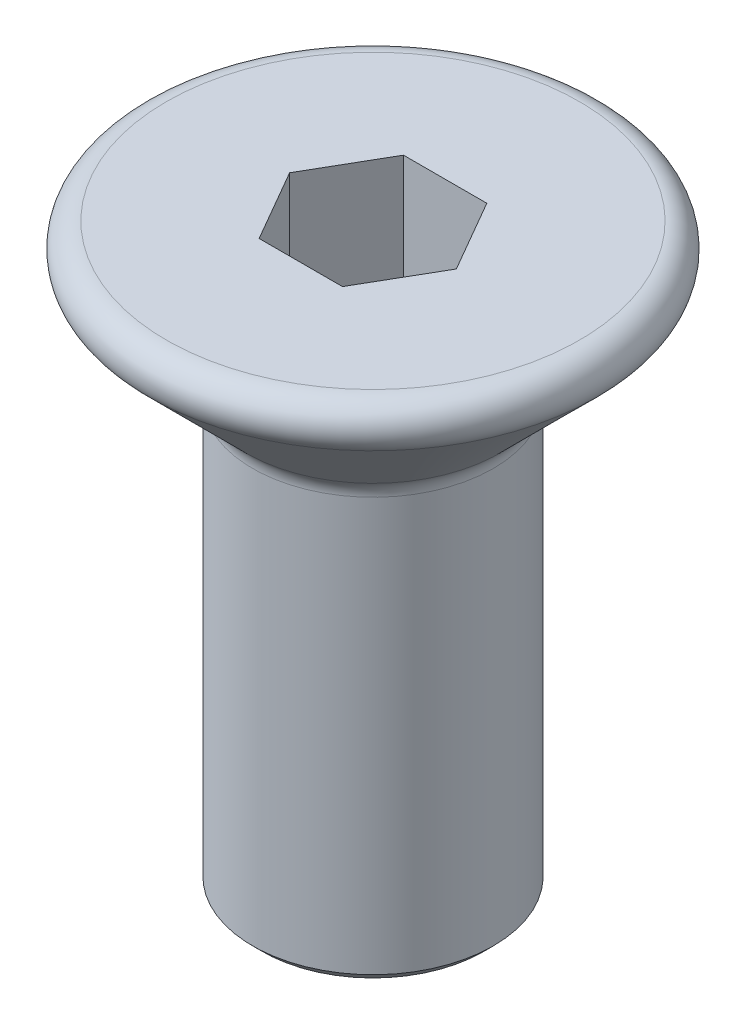
ISO-10303-21;
HEADER;
FILE_DESCRIPTION(('STEP AP214'),'2;1');
FILE_NAME('part.step','',(''),(''),'','','');
FILE_SCHEMA(('AUTOMOTIVE_DESIGN { 1 0 10303 214 1 1 1 1 }'));
ENDSEC;
DATA;
#1=APPLICATION_CONTEXT('core data for automotive mechanical design processes');
#2=APPLICATION_PROTOCOL_DEFINITION('international standard','automotive_design',2000,#1);
#3=PRODUCT_CONTEXT('',#1,'mechanical');
#4=PRODUCT('Part','Part','',(#3));
#5=PRODUCT_RELATED_PRODUCT_CATEGORY('part','',(#4));
#6=PRODUCT_DEFINITION_FORMATION('','',#4);
#7=PRODUCT_DEFINITION_CONTEXT('part definition',#1,'design');
#8=PRODUCT_DEFINITION('design','',#6,#7);
#9=PRODUCT_DEFINITION_SHAPE('','',#8);
#10=(LENGTH_UNIT() NAMED_UNIT(*) SI_UNIT(.MILLI.,.METRE.));
#11=(NAMED_UNIT(*) PLANE_ANGLE_UNIT() SI_UNIT($,.RADIAN.));
#12=(NAMED_UNIT(*) SI_UNIT($,.STERADIAN.) SOLID_ANGLE_UNIT());
#13=UNCERTAINTY_MEASURE_WITH_UNIT(LENGTH_MEASURE(1.E-05),#10,'distance_accuracy_value','');
#14=(GEOMETRIC_REPRESENTATION_CONTEXT(3) GLOBAL_UNCERTAINTY_ASSIGNED_CONTEXT((#13)) GLOBAL_UNIT_ASSIGNED_CONTEXT((#10,
#11,#12)) REPRESENTATION_CONTEXT('',''));
#15=CARTESIAN_POINT('',(0.,0.,0.));
#16=DIRECTION('',(0.,0.,1.));
#17=DIRECTION('',(1.,0.,0.));
#18=AXIS2_PLACEMENT_3D('',#15,#16,#17);
#19=CARTESIAN_POINT('',(0.,0.,0.));
#20=DIRECTION('',(0.,1.,0.));
#21=DIRECTION('',(-1.,0.,0.));
#22=AXIS2_PLACEMENT_3D('',#19,#20,#21);
#23=PLANE('',#22);
#24=DIRECTION('',(0.5,0.,-0.866025403784439));
#25=VECTOR('',#24,1.);
#26=CARTESIAN_POINT('',(0.866025403784439,0.,1.5));
#27=LINE('',#26,#25);
#28=CARTESIAN_POINT('',(0.866025403784439,0.,1.5));
#29=VERTEX_POINT('',#28);
#30=CARTESIAN_POINT('',(1.73205080756887,0.,0.));
#31=VERTEX_POINT('',#30);
#32=EDGE_CURVE('E32',#29,#31,#27,.T.);
#33=ORIENTED_EDGE('',*,*,#32,.F.);
#34=DIRECTION('',(1.,0.,0.));
#35=VECTOR('',#34,1.);
#36=CARTESIAN_POINT('',(-0.866025403784438,0.,1.5));
#37=LINE('',#36,#35);
#38=CARTESIAN_POINT('',(-0.866025403784438,0.,1.5));
#39=VERTEX_POINT('',#38);
#40=EDGE_CURVE('E115',#39,#29,#37,.T.);
#41=ORIENTED_EDGE('',*,*,#40,.F.);
#42=DIRECTION('',(0.5,0.,0.866025403784439));
#43=VECTOR('',#42,1.);
#44=CARTESIAN_POINT('',(-1.73205080756887,0.,0.));
#45=LINE('',#44,#43);
#46=CARTESIAN_POINT('',(-1.73205080756887,0.,0.));
#47=VERTEX_POINT('',#46);
#48=EDGE_CURVE('E113',#47,#39,#45,.T.);
#49=ORIENTED_EDGE('',*,*,#48,.F.);
#50=DIRECTION('',(-0.5,0.,0.866025403784439));
#51=VECTOR('',#50,1.);
#52=CARTESIAN_POINT('',(-0.86602540378444,0.,-1.5));
#53=LINE('',#52,#51);
#54=CARTESIAN_POINT('',(-0.86602540378444,0.,-1.5));
#55=VERTEX_POINT('',#54);
#56=EDGE_CURVE('E80',#55,#47,#53,.T.);
#57=ORIENTED_EDGE('',*,*,#56,.F.);
#58=DIRECTION('',(-1.,0.,0.));
#59=VECTOR('',#58,1.);
#60=CARTESIAN_POINT('',(0.866025403784439,0.,-1.5));
#61=LINE('',#60,#59);
#62=CARTESIAN_POINT('',(0.866025403784439,0.,-1.5));
#63=VERTEX_POINT('',#62);
#64=EDGE_CURVE('E109',#63,#55,#61,.T.);
#65=ORIENTED_EDGE('',*,*,#64,.F.);
#66=DIRECTION('',(-0.5,0.,-0.866025403784439));
#67=VECTOR('',#66,1.);
#68=CARTESIAN_POINT('',(1.73205080756887,0.,0.));
#69=LINE('',#68,#67);
#70=EDGE_CURVE('E106',#31,#63,#69,.T.);
#71=ORIENTED_EDGE('',*,*,#70,.F.);
#72=EDGE_LOOP('',(#33,#41,#49,#57,#65,#71));
#73=FACE_BOUND('',#72,.T.);
#74=CARTESIAN_POINT('',(0.,0.,0.));
#75=DIRECTION('',(0.,1.,0.));
#76=DIRECTION('',(-1.,0.,0.));
#77=AXIS2_PLACEMENT_3D('',#74,#75,#76);
#78=CIRCLE('',#77,4.29289321881348);
#79=CARTESIAN_POINT('',(-4.29289321881348,0.,0.));
#80=VERTEX_POINT('',#79);
#81=EDGE_CURVE('E119',#80,#80,#78,.T.);
#82=ORIENTED_EDGE('',*,*,#81,.T.);
#83=EDGE_LOOP('',(#82));
#84=FACE_BOUND('',#83,.T.);
#85=ADVANCED_FACE('F17',(#73,#84),#23,.T.);
#86=CARTESIAN_POINT('',(0.,0.,0.));
#87=DIRECTION('',(0.,1.,0.));
#88=DIRECTION('',(-1.,0.,0.));
#89=AXIS2_PLACEMENT_3D('',#86,#87,#88);
#90=CONICAL_SURFACE('',#89,5.5,0.785398163397453);
#91=CARTESIAN_POINT('',(0.,-2.85355339059328,0.));
#92=DIRECTION('',(0.,1.,0.));
#93=DIRECTION('',(-1.,0.,0.));
#94=AXIS2_PLACEMENT_3D('',#91,#92,#93);
#95=CIRCLE('',#94,2.64644660940673);
#96=CARTESIAN_POINT('',(-2.64644660940673,-2.85355339059328,0.));
#97=VERTEX_POINT('',#96);
#98=EDGE_CURVE('E130',#97,#97,#95,.T.);
#99=ORIENTED_EDGE('',*,*,#98,.T.);
#100=EDGE_LOOP('',(#99));
#101=FACE_BOUND('',#100,.T.);
#102=CARTESIAN_POINT('',(0.,-0.853553390593276,0.));
#103=DIRECTION('',(0.,-1.,0.));
#104=DIRECTION('',(1.,0.,0.));
#105=AXIS2_PLACEMENT_3D('',#102,#103,#104);
#106=CIRCLE('',#105,4.64644660940675);
#107=CARTESIAN_POINT('',(4.64644660940675,-0.853553390593275,0.));
#108=VERTEX_POINT('',#107);
#109=EDGE_CURVE('E127',#108,#108,#106,.T.);
#110=ORIENTED_EDGE('',*,*,#109,.T.);
#111=EDGE_LOOP('',(#110));
#112=FACE_BOUND('',#111,.T.);
#113=ADVANCED_FACE('F152',(#101,#112),#90,.T.);
#114=CARTESIAN_POINT('',(0.,0.,0.));
#115=DIRECTION('',(0.,1.,0.));
#116=DIRECTION('',(-1.,0.,0.));
#117=AXIS2_PLACEMENT_3D('',#114,#115,#116);
#118=CYLINDRICAL_SURFACE('',#117,2.5);
#119=CARTESIAN_POINT('',(0.,-11.8,0.));
#120=DIRECTION('',(0.,-1.,0.));
#121=DIRECTION('',(1.,0.,0.));
#122=AXIS2_PLACEMENT_3D('',#119,#120,#121);
#123=CIRCLE('',#122,2.5);
#124=CARTESIAN_POINT('',(2.5,-11.8,0.));
#125=VERTEX_POINT('',#124);
#126=EDGE_CURVE('E25',#125,#125,#123,.F.);
#127=ORIENTED_EDGE('',*,*,#126,.T.);
#128=EDGE_LOOP('',(#127));
#129=FACE_BOUND('',#128,.T.);
#130=CARTESIAN_POINT('',(0.,-3.20710678118655,0.));
#131=DIRECTION('',(0.,1.,0.));
#132=DIRECTION('',(-1.,0.,0.));
#133=AXIS2_PLACEMENT_3D('',#130,#131,#132);
#134=CIRCLE('',#133,2.5);
#135=CARTESIAN_POINT('',(-2.5,-3.20710678118655,0.));
#136=VERTEX_POINT('',#135);
#137=EDGE_CURVE('E133',#136,#136,#134,.F.);
#138=ORIENTED_EDGE('',*,*,#137,.T.);
#139=EDGE_LOOP('',(#138));
#140=FACE_BOUND('',#139,.T.);
#141=ADVANCED_FACE('F138',(#129,#140),#118,.T.);
#142=CARTESIAN_POINT('',(-2.5,-12.,0.));
#143=DIRECTION('',(0.,-1.,0.));
#144=DIRECTION('',(1.,0.,0.));
#145=AXIS2_PLACEMENT_3D('',#142,#143,#144);
#146=PLANE('',#145);
#147=CARTESIAN_POINT('',(0.,-12.,0.));
#148=DIRECTION('',(0.,-1.,0.));
#149=DIRECTION('',(1.,0.,0.));
#150=AXIS2_PLACEMENT_3D('',#147,#148,#149);
#151=CIRCLE('',#150,2.3);
#152=CARTESIAN_POINT('',(2.3,-12.,0.));
#153=VERTEX_POINT('',#152);
#154=EDGE_CURVE('E11',#153,#153,#151,.T.);
#155=ORIENTED_EDGE('',*,*,#154,.T.);
#156=EDGE_LOOP('',(#155));
#157=FACE_BOUND('',#156,.T.);
#158=ADVANCED_FACE('F167',(#157),#146,.T.);
#159=CARTESIAN_POINT('',(0.,-0.5,0.));
#160=DIRECTION('',(0.,1.,0.));
#161=DIRECTION('',(-1.,0.,0.));
#162=AXIS2_PLACEMENT_3D('',#159,#160,#161);
#163=TOROIDAL_SURFACE('',#162,4.29289321881348,0.5);
#164=ORIENTED_EDGE('',*,*,#109,.F.);
#165=EDGE_LOOP('',(#164));
#166=FACE_BOUND('',#165,.T.);
#167=ORIENTED_EDGE('',*,*,#81,.F.);
#168=EDGE_LOOP('',(#167));
#169=FACE_BOUND('',#168,.T.);
#170=ADVANCED_FACE('F164',(#166,#169),#163,.T.);
#171=CARTESIAN_POINT('',(0.866025403784471,-3.,1.5));
#172=DIRECTION('',(0.866025403784439,0.,0.5));
#173=DIRECTION('',(0.5,0.,-0.866025403784439));
#174=AXIS2_PLACEMENT_3D('',#171,#172,#173);
#175=PLANE('',#174);
#176=ORIENTED_EDGE('',*,*,#32,.T.);
#177=DIRECTION('',(0.,1.,0.));
#178=VECTOR('',#177,1.);
#179=CARTESIAN_POINT('',(1.73205080756891,-3.,0.));
#180=LINE('',#179,#178);
#181=CARTESIAN_POINT('',(1.73205080756891,-3.,0.));
#182=VERTEX_POINT('',#181);
#183=EDGE_CURVE('E62',#182,#31,#180,.T.);
#184=ORIENTED_EDGE('',*,*,#183,.F.);
#185=DIRECTION('',(0.5,0.,-0.866025403784439));
#186=VECTOR('',#185,1.);
#187=CARTESIAN_POINT('',(0.866025403784471,-3.,1.5));
#188=LINE('',#187,#186);
#189=CARTESIAN_POINT('',(0.866025403784471,-3.,1.5));
#190=VERTEX_POINT('',#189);
#191=EDGE_CURVE('E117',#190,#182,#188,.T.);
#192=ORIENTED_EDGE('',*,*,#191,.F.);
#193=DIRECTION('',(0.,1.,0.));
#194=VECTOR('',#193,1.);
#195=CARTESIAN_POINT('',(0.866025403784471,-3.,1.5));
#196=LINE('',#195,#194);
#197=EDGE_CURVE('E40',#190,#29,#196,.T.);
#198=ORIENTED_EDGE('',*,*,#197,.T.);
#199=EDGE_LOOP('',(#176,#184,#192,#198));
#200=FACE_BOUND('',#199,.T.);
#201=ADVANCED_FACE('F166',(#200),#175,.F.);
#202=CARTESIAN_POINT('',(-0.866025403784406,-3.,1.5));
#203=DIRECTION('',(0.,0.,1.));
#204=DIRECTION('',(1.,0.,0.));
#205=AXIS2_PLACEMENT_3D('',#202,#203,#204);
#206=PLANE('',#205);
#207=ORIENTED_EDGE('',*,*,#40,.T.);
#208=ORIENTED_EDGE('',*,*,#197,.F.);
#209=DIRECTION('',(1.,0.,0.));
#210=VECTOR('',#209,1.);
#211=CARTESIAN_POINT('',(-0.866025403784406,-3.,1.5));
#212=LINE('',#211,#210);
#213=CARTESIAN_POINT('',(-0.866025403784406,-3.,1.5));
#214=VERTEX_POINT('',#213);
#215=EDGE_CURVE('E92',#214,#190,#212,.T.);
#216=ORIENTED_EDGE('',*,*,#215,.F.);
#217=DIRECTION('',(0.,1.,0.));
#218=VECTOR('',#217,1.);
#219=CARTESIAN_POINT('',(-0.866025403784406,-3.,1.5));
#220=LINE('',#219,#218);
#221=EDGE_CURVE('E84',#214,#39,#220,.T.);
#222=ORIENTED_EDGE('',*,*,#221,.T.);
#223=EDGE_LOOP('',(#207,#208,#216,#222));
#224=FACE_BOUND('',#223,.T.);
#225=ADVANCED_FACE('F174',(#224),#206,.F.);
#226=CARTESIAN_POINT('',(-1.73205080756884,-3.,0.));
#227=DIRECTION('',(-0.866025403784439,0.,0.5));
#228=DIRECTION('',(0.5,0.,0.866025403784439));
#229=AXIS2_PLACEMENT_3D('',#226,#227,#228);
#230=PLANE('',#229);
#231=ORIENTED_EDGE('',*,*,#48,.T.);
#232=ORIENTED_EDGE('',*,*,#221,.F.);
#233=DIRECTION('',(0.5,0.,0.866025403784439));
#234=VECTOR('',#233,1.);
#235=CARTESIAN_POINT('',(-1.73205080756884,-3.,0.));
#236=LINE('',#235,#234);
#237=CARTESIAN_POINT('',(-1.73205080756884,-3.,0.));
#238=VERTEX_POINT('',#237);
#239=EDGE_CURVE('E88',#238,#214,#236,.T.);
#240=ORIENTED_EDGE('',*,*,#239,.F.);
#241=DIRECTION('',(0.,1.,0.));
#242=VECTOR('',#241,1.);
#243=CARTESIAN_POINT('',(-1.73205080756884,-3.,0.));
#244=LINE('',#243,#242);
#245=EDGE_CURVE('E73',#238,#47,#244,.T.);
#246=ORIENTED_EDGE('',*,*,#245,.T.);
#247=EDGE_LOOP('',(#231,#232,#240,#246));
#248=FACE_BOUND('',#247,.T.);
#249=ADVANCED_FACE('F89',(#248),#230,.F.);
#250=CARTESIAN_POINT('',(-0.866025403784408,-3.,-1.5));
#251=DIRECTION('',(-0.866025403784439,0.,-0.5));
#252=DIRECTION('',(-0.5,0.,0.866025403784439));
#253=AXIS2_PLACEMENT_3D('',#250,#251,#252);
#254=PLANE('',#253);
#255=ORIENTED_EDGE('',*,*,#56,.T.);
#256=ORIENTED_EDGE('',*,*,#245,.F.);
#257=DIRECTION('',(-0.5,0.,0.866025403784439));
#258=VECTOR('',#257,1.);
#259=CARTESIAN_POINT('',(-0.866025403784408,-3.,-1.5));
#260=LINE('',#259,#258);
#261=CARTESIAN_POINT('',(-0.866025403784408,-3.,-1.5));
#262=VERTEX_POINT('',#261);
#263=EDGE_CURVE('E77',#262,#238,#260,.T.);
#264=ORIENTED_EDGE('',*,*,#263,.F.);
#265=DIRECTION('',(0.,1.,0.));
#266=VECTOR('',#265,1.);
#267=CARTESIAN_POINT('',(-0.866025403784408,-3.,-1.5));
#268=LINE('',#267,#266);
#269=EDGE_CURVE('E85',#262,#55,#268,.T.);
#270=ORIENTED_EDGE('',*,*,#269,.T.);
#271=EDGE_LOOP('',(#255,#256,#264,#270));
#272=FACE_BOUND('',#271,.T.);
#273=ADVANCED_FACE('F75',(#272),#254,.F.);
#274=CARTESIAN_POINT('',(0.86602540378447,-3.,-1.5));
#275=DIRECTION('',(0.,0.,-1.));
#276=DIRECTION('',(-1.,0.,0.));
#277=AXIS2_PLACEMENT_3D('',#274,#275,#276);
#278=PLANE('',#277);
#279=ORIENTED_EDGE('',*,*,#64,.T.);
#280=ORIENTED_EDGE('',*,*,#269,.F.);
#281=DIRECTION('',(-1.,0.,0.));
#282=VECTOR('',#281,1.);
#283=CARTESIAN_POINT('',(0.86602540378447,-3.,-1.5));
#284=LINE('',#283,#282);
#285=CARTESIAN_POINT('',(0.86602540378447,-3.,-1.5));
#286=VERTEX_POINT('',#285);
#287=EDGE_CURVE('E98',#286,#262,#284,.T.);
#288=ORIENTED_EDGE('',*,*,#287,.F.);
#289=DIRECTION('',(0.,1.,0.));
#290=VECTOR('',#289,1.);
#291=CARTESIAN_POINT('',(0.86602540378447,-3.,-1.5));
#292=LINE('',#291,#290);
#293=EDGE_CURVE('E122',#286,#63,#292,.T.);
#294=ORIENTED_EDGE('',*,*,#293,.T.);
#295=EDGE_LOOP('',(#279,#280,#288,#294));
#296=FACE_BOUND('',#295,.T.);
#297=ADVANCED_FACE('F190',(#296),#278,.F.);
#298=CARTESIAN_POINT('',(1.73205080756891,-3.,0.));
#299=DIRECTION('',(0.866025403784438,0.,-0.5));
#300=DIRECTION('',(-0.5,0.,-0.866025403784439));
#301=AXIS2_PLACEMENT_3D('',#298,#299,#300);
#302=PLANE('',#301);
#303=ORIENTED_EDGE('',*,*,#70,.T.);
#304=ORIENTED_EDGE('',*,*,#293,.F.);
#305=DIRECTION('',(-0.5,0.,-0.866025403784439));
#306=VECTOR('',#305,1.);
#307=CARTESIAN_POINT('',(1.73205080756891,-3.,0.));
#308=LINE('',#307,#306);
#309=EDGE_CURVE('E100',#182,#286,#308,.T.);
#310=ORIENTED_EDGE('',*,*,#309,.F.);
#311=ORIENTED_EDGE('',*,*,#183,.T.);
#312=EDGE_LOOP('',(#303,#304,#310,#311));
#313=FACE_BOUND('',#312,.T.);
#314=ADVANCED_FACE('F187',(#313),#302,.F.);
#315=CARTESIAN_POINT('',(0.,-3.,0.));
#316=DIRECTION('',(0.,1.,0.));
#317=DIRECTION('',(-1.,0.,0.));
#318=AXIS2_PLACEMENT_3D('',#315,#316,#317);
#319=PLANE('',#318);
#320=ORIENTED_EDGE('',*,*,#191,.T.);
#321=ORIENTED_EDGE('',*,*,#309,.T.);
#322=ORIENTED_EDGE('',*,*,#287,.T.);
#323=ORIENTED_EDGE('',*,*,#263,.T.);
#324=ORIENTED_EDGE('',*,*,#239,.T.);
#325=ORIENTED_EDGE('',*,*,#215,.T.);
#326=EDGE_LOOP('',(#320,#321,#322,#323,#324,#325));
#327=FACE_BOUND('',#326,.T.);
#328=ADVANCED_FACE('F95',(#327),#319,.T.);
#329=CARTESIAN_POINT('',(0.,-3.20710678118655,0.));
#330=DIRECTION('',(0.,1.,0.));
#331=DIRECTION('',(-1.,0.,0.));
#332=AXIS2_PLACEMENT_3D('',#329,#330,#331);
#333=TOROIDAL_SURFACE('',#332,3.,0.5);
#334=ORIENTED_EDGE('',*,*,#137,.F.);
#335=EDGE_LOOP('',(#334));
#336=FACE_BOUND('',#335,.T.);
#337=ORIENTED_EDGE('',*,*,#98,.F.);
#338=EDGE_LOOP('',(#337));
#339=FACE_BOUND('',#338,.T.);
#340=ADVANCED_FACE('F142',(#336,#339),#333,.F.);
#341=CARTESIAN_POINT('',(0.,-11.8,0.));
#342=DIRECTION('',(0.,1.,0.));
#343=DIRECTION('',(-1.,0.,0.));
#344=AXIS2_PLACEMENT_3D('',#341,#342,#343);
#345=CONICAL_SURFACE('',#344,2.5,0.785398163397443);
#346=ORIENTED_EDGE('',*,*,#154,.F.);
#347=EDGE_LOOP('',(#346));
#348=FACE_BOUND('',#347,.T.);
#349=ORIENTED_EDGE('',*,*,#126,.F.);
#350=EDGE_LOOP('',(#349));
#351=FACE_BOUND('',#350,.T.);
#352=ADVANCED_FACE('F19',(#348,#351),#345,.T.);
#353=CLOSED_SHELL('',(#85,#113,#141,#158,#170,#201,#225,#249,#273,#297,#314,#328,#340,#352));
#354=MANIFOLD_SOLID_BREP('B1',#353);
#355=ADVANCED_BREP_SHAPE_REPRESENTATION('',(#18,#354),#14);
#356=SHAPE_DEFINITION_REPRESENTATION(#9,#355);
ENDSEC;
END-ISO-10303-21;
